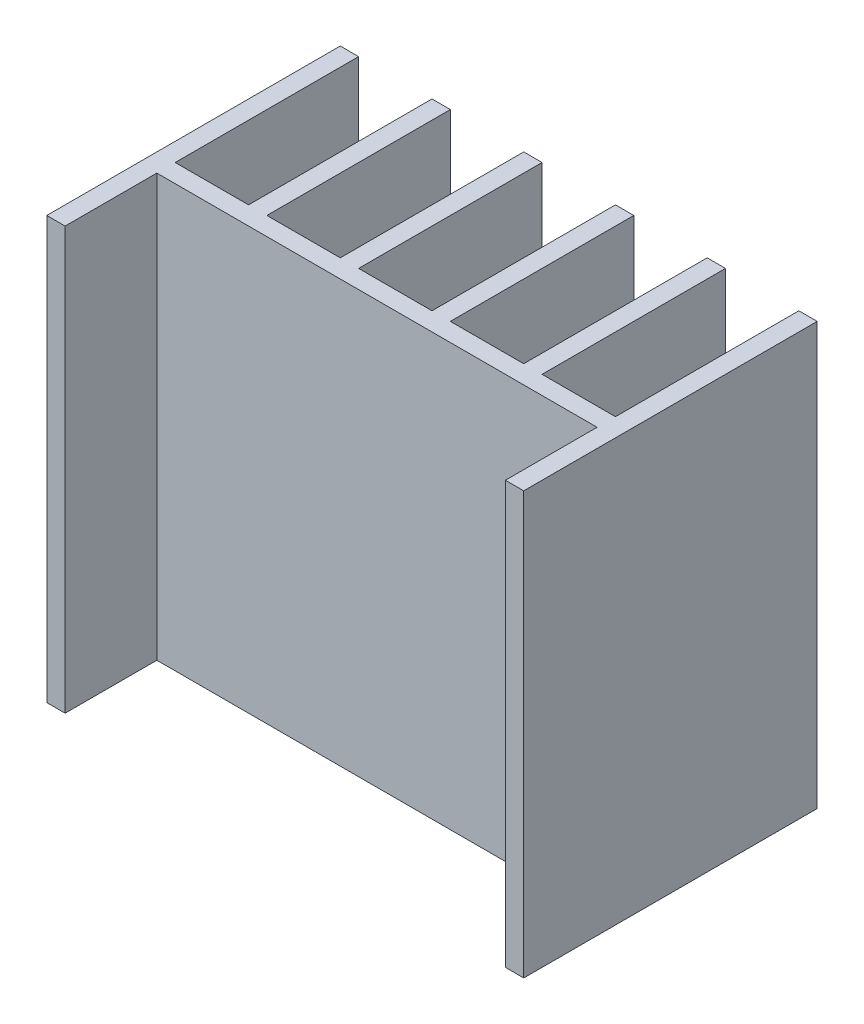
ISO-10303-21;
HEADER;
FILE_DESCRIPTION(('STEP AP214'),'2;1');
FILE_NAME('part.step','',(''),(''),'','','');
FILE_SCHEMA(('AUTOMOTIVE_DESIGN { 1 0 10303 214 1 1 1 1 }'));
ENDSEC;
DATA;
#1=APPLICATION_CONTEXT('core data for automotive mechanical design processes');
#2=APPLICATION_PROTOCOL_DEFINITION('international standard','automotive_design',2000,#1);
#3=PRODUCT_CONTEXT('',#1,'mechanical');
#4=PRODUCT('Part','Part','',(#3));
#5=PRODUCT_RELATED_PRODUCT_CATEGORY('part','',(#4));
#6=PRODUCT_DEFINITION_FORMATION('','',#4);
#7=PRODUCT_DEFINITION_CONTEXT('part definition',#1,'design');
#8=PRODUCT_DEFINITION('design','',#6,#7);
#9=PRODUCT_DEFINITION_SHAPE('','',#8);
#10=(LENGTH_UNIT() NAMED_UNIT(*) SI_UNIT(.MILLI.,.METRE.));
#11=(NAMED_UNIT(*) PLANE_ANGLE_UNIT() SI_UNIT($,.RADIAN.));
#12=(NAMED_UNIT(*) SI_UNIT($,.STERADIAN.) SOLID_ANGLE_UNIT());
#13=UNCERTAINTY_MEASURE_WITH_UNIT(LENGTH_MEASURE(1.E-05),#10,'distance_accuracy_value','');
#14=(GEOMETRIC_REPRESENTATION_CONTEXT(3) GLOBAL_UNCERTAINTY_ASSIGNED_CONTEXT((#13)) GLOBAL_UNIT_ASSIGNED_CONTEXT((#10,
#11,#12)) REPRESENTATION_CONTEXT('',''));
#15=CARTESIAN_POINT('',(0.,0.,0.));
#16=DIRECTION('',(0.,0.,1.));
#17=DIRECTION('',(1.,0.,0.));
#18=AXIS2_PLACEMENT_3D('',#15,#16,#17);
#19=CARTESIAN_POINT('',(12.,23.,-11.));
#20=DIRECTION('',(0.,0.,1.));
#21=DIRECTION('',(1.,0.,0.));
#22=AXIS2_PLACEMENT_3D('',#19,#20,#21);
#23=PLANE('',#22);
#24=DIRECTION('',(-1.,0.,0.));
#25=VECTOR('',#24,1.);
#26=CARTESIAN_POINT('',(12.,0.,-11.));
#27=LINE('',#26,#25);
#28=CARTESIAN_POINT('',(13.,0.,-11.));
#29=VERTEX_POINT('',#28);
#30=CARTESIAN_POINT('',(12.,0.,-11.));
#31=VERTEX_POINT('',#30);
#32=EDGE_CURVE('E251',#29,#31,#27,.T.);
#33=ORIENTED_EDGE('',*,*,#32,.T.);
#34=DIRECTION('',(0.,-1.,0.));
#35=VECTOR('',#34,1.);
#36=CARTESIAN_POINT('',(12.,23.,-11.));
#37=LINE('',#36,#35);
#38=CARTESIAN_POINT('',(12.,23.,-11.));
#39=VERTEX_POINT('',#38);
#40=EDGE_CURVE('E11',#39,#31,#37,.T.);
#41=ORIENTED_EDGE('',*,*,#40,.F.);
#42=DIRECTION('',(-1.,0.,0.));
#43=VECTOR('',#42,1.);
#44=CARTESIAN_POINT('',(12.,23.,-11.));
#45=LINE('',#44,#43);
#46=CARTESIAN_POINT('',(13.,23.,-11.));
#47=VERTEX_POINT('',#46);
#48=EDGE_CURVE('E307',#47,#39,#45,.T.);
#49=ORIENTED_EDGE('',*,*,#48,.F.);
#50=DIRECTION('',(0.,-1.,0.));
#51=VECTOR('',#50,1.);
#52=CARTESIAN_POINT('',(13.,23.,-11.));
#53=LINE('',#52,#51);
#54=EDGE_CURVE('E247',#47,#29,#53,.T.);
#55=ORIENTED_EDGE('',*,*,#54,.T.);
#56=EDGE_LOOP('',(#33,#41,#49,#55));
#57=FACE_BOUND('',#56,.T.);
#58=ADVANCED_FACE('F34',(#57),#23,.F.);
#59=CARTESIAN_POINT('',(12.,23.,-11.));
#60=DIRECTION('',(1.,0.,0.));
#61=DIRECTION('',(0.,0.,-1.));
#62=AXIS2_PLACEMENT_3D('',#59,#60,#61);
#63=PLANE('',#62);
#64=DIRECTION('',(0.,0.,1.));
#65=VECTOR('',#64,1.);
#66=CARTESIAN_POINT('',(12.,0.,-11.));
#67=LINE('',#66,#65);
#68=CARTESIAN_POINT('',(12.,0.,-0.999999999999995));
#69=VERTEX_POINT('',#68);
#70=EDGE_CURVE('E254',#31,#69,#67,.T.);
#71=ORIENTED_EDGE('',*,*,#70,.T.);
#72=DIRECTION('',(0.,-1.,0.));
#73=VECTOR('',#72,1.);
#74=CARTESIAN_POINT('',(12.,23.,-0.999999999999995));
#75=LINE('',#74,#73);
#76=CARTESIAN_POINT('',(12.,23.,-0.999999999999995));
#77=VERTEX_POINT('',#76);
#78=EDGE_CURVE('E42',#77,#69,#75,.T.);
#79=ORIENTED_EDGE('',*,*,#78,.F.);
#80=DIRECTION('',(0.,0.,1.));
#81=VECTOR('',#80,1.);
#82=CARTESIAN_POINT('',(12.,23.,-11.));
#83=LINE('',#82,#81);
#84=EDGE_CURVE('E151',#39,#77,#83,.T.);
#85=ORIENTED_EDGE('',*,*,#84,.F.);
#86=ORIENTED_EDGE('',*,*,#40,.T.);
#87=EDGE_LOOP('',(#71,#79,#85,#86));
#88=FACE_BOUND('',#87,.T.);
#89=ADVANCED_FACE('F455',(#88),#63,.F.);
#90=CARTESIAN_POINT('',(12.,23.,-0.999999999999995));
#91=DIRECTION('',(0.,0.,1.));
#92=DIRECTION('',(1.,0.,0.));
#93=AXIS2_PLACEMENT_3D('',#90,#91,#92);
#94=PLANE('',#93);
#95=DIRECTION('',(-1.,0.,0.));
#96=VECTOR('',#95,1.);
#97=CARTESIAN_POINT('',(12.,0.,-0.999999999999995));
#98=LINE('',#97,#96);
#99=CARTESIAN_POINT('',(8.,0.,-0.999999999999994));
#100=VERTEX_POINT('',#99);
#101=EDGE_CURVE('E256',#69,#100,#98,.T.);
#102=ORIENTED_EDGE('',*,*,#101,.T.);
#103=DIRECTION('',(0.,-1.,0.));
#104=VECTOR('',#103,1.);
#105=CARTESIAN_POINT('',(8.,23.,-0.999999999999994));
#106=LINE('',#105,#104);
#107=CARTESIAN_POINT('',(8.,23.,-0.999999999999994));
#108=VERTEX_POINT('',#107);
#109=EDGE_CURVE('E374',#108,#100,#106,.T.);
#110=ORIENTED_EDGE('',*,*,#109,.F.);
#111=DIRECTION('',(-1.,0.,0.));
#112=VECTOR('',#111,1.);
#113=CARTESIAN_POINT('',(12.,23.,-0.999999999999995));
#114=LINE('',#113,#112);
#115=EDGE_CURVE('E382',#77,#108,#114,.T.);
#116=ORIENTED_EDGE('',*,*,#115,.F.);
#117=ORIENTED_EDGE('',*,*,#78,.T.);
#118=EDGE_LOOP('',(#102,#110,#116,#117));
#119=FACE_BOUND('',#118,.T.);
#120=ADVANCED_FACE('F380',(#119),#94,.F.);
#121=CARTESIAN_POINT('',(8.,23.,-11.));
#122=DIRECTION('',(-1.,0.,0.));
#123=DIRECTION('',(0.,0.,1.));
#124=AXIS2_PLACEMENT_3D('',#121,#122,#123);
#125=PLANE('',#124);
#126=DIRECTION('',(0.,0.,-1.));
#127=VECTOR('',#126,1.);
#128=CARTESIAN_POINT('',(8.,0.,-11.));
#129=LINE('',#128,#127);
#130=CARTESIAN_POINT('',(8.,0.,-11.));
#131=VERTEX_POINT('',#130);
#132=EDGE_CURVE('E258',#100,#131,#129,.T.);
#133=ORIENTED_EDGE('',*,*,#132,.T.);
#134=DIRECTION('',(0.,-1.,0.));
#135=VECTOR('',#134,1.);
#136=CARTESIAN_POINT('',(8.,23.,-11.));
#137=LINE('',#136,#135);
#138=CARTESIAN_POINT('',(8.,23.,-11.));
#139=VERTEX_POINT('',#138);
#140=EDGE_CURVE('E371',#139,#131,#137,.T.);
#141=ORIENTED_EDGE('',*,*,#140,.F.);
#142=DIRECTION('',(0.,0.,-1.));
#143=VECTOR('',#142,1.);
#144=CARTESIAN_POINT('',(8.,23.,-11.));
#145=LINE('',#144,#143);
#146=EDGE_CURVE('E398',#108,#139,#145,.T.);
#147=ORIENTED_EDGE('',*,*,#146,.F.);
#148=ORIENTED_EDGE('',*,*,#109,.T.);
#149=EDGE_LOOP('',(#133,#141,#147,#148));
#150=FACE_BOUND('',#149,.T.);
#151=ADVANCED_FACE('F389',(#150),#125,.F.);
#152=CARTESIAN_POINT('',(7.,23.,-11.));
#153=DIRECTION('',(0.,0.,1.));
#154=DIRECTION('',(1.,0.,0.));
#155=AXIS2_PLACEMENT_3D('',#152,#153,#154);
#156=PLANE('',#155);
#157=DIRECTION('',(-1.,0.,0.));
#158=VECTOR('',#157,1.);
#159=CARTESIAN_POINT('',(7.,0.,-11.));
#160=LINE('',#159,#158);
#161=CARTESIAN_POINT('',(7.,0.,-11.));
#162=VERTEX_POINT('',#161);
#163=EDGE_CURVE('E260',#131,#162,#160,.T.);
#164=ORIENTED_EDGE('',*,*,#163,.T.);
#165=DIRECTION('',(0.,-1.,0.));
#166=VECTOR('',#165,1.);
#167=CARTESIAN_POINT('',(7.,23.,-11.));
#168=LINE('',#167,#166);
#169=CARTESIAN_POINT('',(7.,23.,-11.));
#170=VERTEX_POINT('',#169);
#171=EDGE_CURVE('E368',#170,#162,#168,.T.);
#172=ORIENTED_EDGE('',*,*,#171,.F.);
#173=DIRECTION('',(-1.,0.,0.));
#174=VECTOR('',#173,1.);
#175=CARTESIAN_POINT('',(7.,23.,-11.));
#176=LINE('',#175,#174);
#177=EDGE_CURVE('E395',#139,#170,#176,.T.);
#178=ORIENTED_EDGE('',*,*,#177,.F.);
#179=ORIENTED_EDGE('',*,*,#140,.T.);
#180=EDGE_LOOP('',(#164,#172,#178,#179));
#181=FACE_BOUND('',#180,.T.);
#182=ADVANCED_FACE('F393',(#181),#156,.F.);
#183=CARTESIAN_POINT('',(7.,23.,-11.));
#184=DIRECTION('',(1.,0.,0.));
#185=DIRECTION('',(0.,0.,-1.));
#186=AXIS2_PLACEMENT_3D('',#183,#184,#185);
#187=PLANE('',#186);
#188=DIRECTION('',(0.,0.,1.));
#189=VECTOR('',#188,1.);
#190=CARTESIAN_POINT('',(7.,0.,-11.));
#191=LINE('',#190,#189);
#192=CARTESIAN_POINT('',(7.,0.,-1.));
#193=VERTEX_POINT('',#192);
#194=EDGE_CURVE('E262',#162,#193,#191,.T.);
#195=ORIENTED_EDGE('',*,*,#194,.T.);
#196=DIRECTION('',(0.,-1.,0.));
#197=VECTOR('',#196,1.);
#198=CARTESIAN_POINT('',(7.,23.,-1.));
#199=LINE('',#198,#197);
#200=CARTESIAN_POINT('',(7.,23.,-1.));
#201=VERTEX_POINT('',#200);
#202=EDGE_CURVE('E365',#201,#193,#199,.T.);
#203=ORIENTED_EDGE('',*,*,#202,.F.);
#204=DIRECTION('',(0.,0.,1.));
#205=VECTOR('',#204,1.);
#206=CARTESIAN_POINT('',(7.,23.,-11.));
#207=LINE('',#206,#205);
#208=EDGE_CURVE('E397',#170,#201,#207,.T.);
#209=ORIENTED_EDGE('',*,*,#208,.F.);
#210=ORIENTED_EDGE('',*,*,#171,.T.);
#211=EDGE_LOOP('',(#195,#203,#209,#210));
#212=FACE_BOUND('',#211,.T.);
#213=ADVANCED_FACE('F467',(#212),#187,.F.);
#214=CARTESIAN_POINT('',(7.,23.,-1.));
#215=DIRECTION('',(0.,0.,1.));
#216=DIRECTION('',(1.,0.,0.));
#217=AXIS2_PLACEMENT_3D('',#214,#215,#216);
#218=PLANE('',#217);
#219=DIRECTION('',(-1.,0.,0.));
#220=VECTOR('',#219,1.);
#221=CARTESIAN_POINT('',(7.,0.,-1.));
#222=LINE('',#221,#220);
#223=CARTESIAN_POINT('',(3.,0.,-0.999999999999999));
#224=VERTEX_POINT('',#223);
#225=EDGE_CURVE('E264',#193,#224,#222,.T.);
#226=ORIENTED_EDGE('',*,*,#225,.T.);
#227=DIRECTION('',(0.,-1.,0.));
#228=VECTOR('',#227,1.);
#229=CARTESIAN_POINT('',(3.,23.,-0.999999999999999));
#230=LINE('',#229,#228);
#231=CARTESIAN_POINT('',(3.,23.,-0.999999999999999));
#232=VERTEX_POINT('',#231);
#233=EDGE_CURVE('E362',#232,#224,#230,.T.);
#234=ORIENTED_EDGE('',*,*,#233,.F.);
#235=DIRECTION('',(-1.,0.,0.));
#236=VECTOR('',#235,1.);
#237=CARTESIAN_POINT('',(7.,23.,-1.));
#238=LINE('',#237,#236);
#239=EDGE_CURVE('E400',#201,#232,#238,.T.);
#240=ORIENTED_EDGE('',*,*,#239,.F.);
#241=ORIENTED_EDGE('',*,*,#202,.T.);
#242=EDGE_LOOP('',(#226,#234,#240,#241));
#243=FACE_BOUND('',#242,.T.);
#244=ADVANCED_FACE('F470',(#243),#218,.F.);
#245=CARTESIAN_POINT('',(3.,23.,-11.));
#246=DIRECTION('',(-1.,0.,0.));
#247=DIRECTION('',(0.,0.,1.));
#248=AXIS2_PLACEMENT_3D('',#245,#246,#247);
#249=PLANE('',#248);
#250=DIRECTION('',(0.,0.,-1.));
#251=VECTOR('',#250,1.);
#252=CARTESIAN_POINT('',(3.,0.,-11.));
#253=LINE('',#252,#251);
#254=CARTESIAN_POINT('',(3.,0.,-11.));
#255=VERTEX_POINT('',#254);
#256=EDGE_CURVE('E266',#224,#255,#253,.T.);
#257=ORIENTED_EDGE('',*,*,#256,.T.);
#258=DIRECTION('',(0.,-1.,0.));
#259=VECTOR('',#258,1.);
#260=CARTESIAN_POINT('',(3.,23.,-11.));
#261=LINE('',#260,#259);
#262=CARTESIAN_POINT('',(3.,23.,-11.));
#263=VERTEX_POINT('',#262);
#264=EDGE_CURVE('E359',#263,#255,#261,.T.);
#265=ORIENTED_EDGE('',*,*,#264,.F.);
#266=DIRECTION('',(0.,0.,-1.));
#267=VECTOR('',#266,1.);
#268=CARTESIAN_POINT('',(3.,23.,-11.));
#269=LINE('',#268,#267);
#270=EDGE_CURVE('E406',#232,#263,#269,.T.);
#271=ORIENTED_EDGE('',*,*,#270,.F.);
#272=ORIENTED_EDGE('',*,*,#233,.T.);
#273=EDGE_LOOP('',(#257,#265,#271,#272));
#274=FACE_BOUND('',#273,.T.);
#275=ADVANCED_FACE('F474',(#274),#249,.F.);
#276=CARTESIAN_POINT('',(2.,23.,-11.));
#277=DIRECTION('',(0.,0.,1.));
#278=DIRECTION('',(1.,0.,0.));
#279=AXIS2_PLACEMENT_3D('',#276,#277,#278);
#280=PLANE('',#279);
#281=DIRECTION('',(-1.,0.,0.));
#282=VECTOR('',#281,1.);
#283=CARTESIAN_POINT('',(2.,0.,-11.));
#284=LINE('',#283,#282);
#285=CARTESIAN_POINT('',(2.,0.,-11.));
#286=VERTEX_POINT('',#285);
#287=EDGE_CURVE('E268',#255,#286,#284,.T.);
#288=ORIENTED_EDGE('',*,*,#287,.T.);
#289=DIRECTION('',(0.,-1.,0.));
#290=VECTOR('',#289,1.);
#291=CARTESIAN_POINT('',(2.,23.,-11.));
#292=LINE('',#291,#290);
#293=CARTESIAN_POINT('',(2.,23.,-11.));
#294=VERTEX_POINT('',#293);
#295=EDGE_CURVE('E356',#294,#286,#292,.T.);
#296=ORIENTED_EDGE('',*,*,#295,.F.);
#297=DIRECTION('',(-1.,0.,0.));
#298=VECTOR('',#297,1.);
#299=CARTESIAN_POINT('',(2.,23.,-11.));
#300=LINE('',#299,#298);
#301=EDGE_CURVE('E408',#263,#294,#300,.T.);
#302=ORIENTED_EDGE('',*,*,#301,.F.);
#303=ORIENTED_EDGE('',*,*,#264,.T.);
#304=EDGE_LOOP('',(#288,#296,#302,#303));
#305=FACE_BOUND('',#304,.T.);
#306=ADVANCED_FACE('F478',(#305),#280,.F.);
#307=CARTESIAN_POINT('',(2.,23.,-11.));
#308=DIRECTION('',(1.,0.,0.));
#309=DIRECTION('',(0.,0.,-1.));
#310=AXIS2_PLACEMENT_3D('',#307,#308,#309);
#311=PLANE('',#310);
#312=DIRECTION('',(0.,0.,1.));
#313=VECTOR('',#312,1.);
#314=CARTESIAN_POINT('',(2.,0.,-11.));
#315=LINE('',#314,#313);
#316=CARTESIAN_POINT('',(2.,0.,-0.999999999999999));
#317=VERTEX_POINT('',#316);
#318=EDGE_CURVE('E270',#286,#317,#315,.T.);
#319=ORIENTED_EDGE('',*,*,#318,.T.);
#320=DIRECTION('',(0.,-1.,0.));
#321=VECTOR('',#320,1.);
#322=CARTESIAN_POINT('',(2.,23.,-0.999999999999999));
#323=LINE('',#322,#321);
#324=CARTESIAN_POINT('',(2.,23.,-0.999999999999999));
#325=VERTEX_POINT('',#324);
#326=EDGE_CURVE('E353',#325,#317,#323,.T.);
#327=ORIENTED_EDGE('',*,*,#326,.F.);
#328=DIRECTION('',(0.,0.,1.));
#329=VECTOR('',#328,1.);
#330=CARTESIAN_POINT('',(2.,23.,-11.));
#331=LINE('',#330,#329);
#332=EDGE_CURVE('E410',#294,#325,#331,.T.);
#333=ORIENTED_EDGE('',*,*,#332,.F.);
#334=ORIENTED_EDGE('',*,*,#295,.T.);
#335=EDGE_LOOP('',(#319,#327,#333,#334));
#336=FACE_BOUND('',#335,.T.);
#337=ADVANCED_FACE('F482',(#336),#311,.F.);
#338=CARTESIAN_POINT('',(-2.,23.,-0.999999999999999));
#339=DIRECTION('',(0.,0.,1.));
#340=DIRECTION('',(1.,0.,0.));
#341=AXIS2_PLACEMENT_3D('',#338,#339,#340);
#342=PLANE('',#341);
#343=DIRECTION('',(-1.,0.,0.));
#344=VECTOR('',#343,1.);
#345=CARTESIAN_POINT('',(-2.,0.,-0.999999999999999));
#346=LINE('',#345,#344);
#347=CARTESIAN_POINT('',(-2.,0.,-0.999999999999999));
#348=VERTEX_POINT('',#347);
#349=EDGE_CURVE('E272',#317,#348,#346,.T.);
#350=ORIENTED_EDGE('',*,*,#349,.T.);
#351=DIRECTION('',(0.,-1.,0.));
#352=VECTOR('',#351,1.);
#353=CARTESIAN_POINT('',(-2.,23.,-0.999999999999999));
#354=LINE('',#353,#352);
#355=CARTESIAN_POINT('',(-2.,23.,-0.999999999999999));
#356=VERTEX_POINT('',#355);
#357=EDGE_CURVE('E350',#356,#348,#354,.T.);
#358=ORIENTED_EDGE('',*,*,#357,.F.);
#359=DIRECTION('',(-1.,0.,0.));
#360=VECTOR('',#359,1.);
#361=CARTESIAN_POINT('',(-2.,23.,-0.999999999999999));
#362=LINE('',#361,#360);
#363=EDGE_CURVE('E412',#325,#356,#362,.T.);
#364=ORIENTED_EDGE('',*,*,#363,.F.);
#365=ORIENTED_EDGE('',*,*,#326,.T.);
#366=EDGE_LOOP('',(#350,#358,#364,#365));
#367=FACE_BOUND('',#366,.T.);
#368=ADVANCED_FACE('F486',(#367),#342,.F.);
#369=CARTESIAN_POINT('',(-2.,23.,-11.));
#370=DIRECTION('',(-1.,0.,0.));
#371=DIRECTION('',(0.,0.,1.));
#372=AXIS2_PLACEMENT_3D('',#369,#370,#371);
#373=PLANE('',#372);
#374=DIRECTION('',(0.,0.,-1.));
#375=VECTOR('',#374,1.);
#376=CARTESIAN_POINT('',(-2.,0.,-11.));
#377=LINE('',#376,#375);
#378=CARTESIAN_POINT('',(-2.,0.,-11.));
#379=VERTEX_POINT('',#378);
#380=EDGE_CURVE('E274',#348,#379,#377,.T.);
#381=ORIENTED_EDGE('',*,*,#380,.T.);
#382=DIRECTION('',(0.,-1.,0.));
#383=VECTOR('',#382,1.);
#384=CARTESIAN_POINT('',(-2.,23.,-11.));
#385=LINE('',#384,#383);
#386=CARTESIAN_POINT('',(-2.,23.,-11.));
#387=VERTEX_POINT('',#386);
#388=EDGE_CURVE('E347',#387,#379,#385,.T.);
#389=ORIENTED_EDGE('',*,*,#388,.F.);
#390=DIRECTION('',(0.,0.,-1.));
#391=VECTOR('',#390,1.);
#392=CARTESIAN_POINT('',(-2.,23.,-11.));
#393=LINE('',#392,#391);
#394=EDGE_CURVE('E414',#356,#387,#393,.T.);
#395=ORIENTED_EDGE('',*,*,#394,.F.);
#396=ORIENTED_EDGE('',*,*,#357,.T.);
#397=EDGE_LOOP('',(#381,#389,#395,#396));
#398=FACE_BOUND('',#397,.T.);
#399=ADVANCED_FACE('F490',(#398),#373,.F.);
#400=CARTESIAN_POINT('',(-2.,23.,-11.));
#401=DIRECTION('',(0.,0.,1.));
#402=DIRECTION('',(1.,0.,0.));
#403=AXIS2_PLACEMENT_3D('',#400,#401,#402);
#404=PLANE('',#403);
#405=DIRECTION('',(-1.,0.,0.));
#406=VECTOR('',#405,1.);
#407=CARTESIAN_POINT('',(-2.,0.,-11.));
#408=LINE('',#407,#406);
#409=CARTESIAN_POINT('',(-3.,0.,-11.));
#410=VERTEX_POINT('',#409);
#411=EDGE_CURVE('E276',#379,#410,#408,.T.);
#412=ORIENTED_EDGE('',*,*,#411,.T.);
#413=DIRECTION('',(0.,-1.,0.));
#414=VECTOR('',#413,1.);
#415=CARTESIAN_POINT('',(-3.,23.,-11.));
#416=LINE('',#415,#414);
#417=CARTESIAN_POINT('',(-3.,23.,-11.));
#418=VERTEX_POINT('',#417);
#419=EDGE_CURVE('E344',#418,#410,#416,.T.);
#420=ORIENTED_EDGE('',*,*,#419,.F.);
#421=DIRECTION('',(-1.,0.,0.));
#422=VECTOR('',#421,1.);
#423=CARTESIAN_POINT('',(-2.,23.,-11.));
#424=LINE('',#423,#422);
#425=EDGE_CURVE('E416',#387,#418,#424,.T.);
#426=ORIENTED_EDGE('',*,*,#425,.F.);
#427=ORIENTED_EDGE('',*,*,#388,.T.);
#428=EDGE_LOOP('',(#412,#420,#426,#427));
#429=FACE_BOUND('',#428,.T.);
#430=ADVANCED_FACE('F494',(#429),#404,.F.);
#431=CARTESIAN_POINT('',(-3.,23.,-11.));
#432=DIRECTION('',(1.,0.,0.));
#433=DIRECTION('',(0.,0.,-1.));
#434=AXIS2_PLACEMENT_3D('',#431,#432,#433);
#435=PLANE('',#434);
#436=DIRECTION('',(0.,0.,1.));
#437=VECTOR('',#436,1.);
#438=CARTESIAN_POINT('',(-3.,0.,-11.));
#439=LINE('',#438,#437);
#440=CARTESIAN_POINT('',(-3.,0.,-0.999999999999999));
#441=VERTEX_POINT('',#440);
#442=EDGE_CURVE('E278',#410,#441,#439,.T.);
#443=ORIENTED_EDGE('',*,*,#442,.T.);
#444=DIRECTION('',(0.,-1.,0.));
#445=VECTOR('',#444,1.);
#446=CARTESIAN_POINT('',(-3.,23.,-0.999999999999999));
#447=LINE('',#446,#445);
#448=CARTESIAN_POINT('',(-3.,23.,-0.999999999999999));
#449=VERTEX_POINT('',#448);
#450=EDGE_CURVE('E341',#449,#441,#447,.T.);
#451=ORIENTED_EDGE('',*,*,#450,.F.);
#452=DIRECTION('',(0.,0.,1.));
#453=VECTOR('',#452,1.);
#454=CARTESIAN_POINT('',(-3.,23.,-11.));
#455=LINE('',#454,#453);
#456=EDGE_CURVE('E418',#418,#449,#455,.T.);
#457=ORIENTED_EDGE('',*,*,#456,.F.);
#458=ORIENTED_EDGE('',*,*,#419,.T.);
#459=EDGE_LOOP('',(#443,#451,#457,#458));
#460=FACE_BOUND('',#459,.T.);
#461=ADVANCED_FACE('F498',(#460),#435,.F.);
#462=CARTESIAN_POINT('',(-7.,23.,-1.));
#463=DIRECTION('',(0.,0.,1.));
#464=DIRECTION('',(1.,0.,0.));
#465=AXIS2_PLACEMENT_3D('',#462,#463,#464);
#466=PLANE('',#465);
#467=DIRECTION('',(-1.,0.,0.));
#468=VECTOR('',#467,1.);
#469=CARTESIAN_POINT('',(-7.,0.,-1.));
#470=LINE('',#469,#468);
#471=CARTESIAN_POINT('',(-7.,0.,-1.));
#472=VERTEX_POINT('',#471);
#473=EDGE_CURVE('E280',#441,#472,#470,.T.);
#474=ORIENTED_EDGE('',*,*,#473,.T.);
#475=DIRECTION('',(0.,-1.,0.));
#476=VECTOR('',#475,1.);
#477=CARTESIAN_POINT('',(-7.,23.,-1.));
#478=LINE('',#477,#476);
#479=CARTESIAN_POINT('',(-7.,23.,-1.));
#480=VERTEX_POINT('',#479);
#481=EDGE_CURVE('E338',#480,#472,#478,.T.);
#482=ORIENTED_EDGE('',*,*,#481,.F.);
#483=DIRECTION('',(-1.,0.,0.));
#484=VECTOR('',#483,1.);
#485=CARTESIAN_POINT('',(-7.,23.,-1.));
#486=LINE('',#485,#484);
#487=EDGE_CURVE('E420',#449,#480,#486,.T.);
#488=ORIENTED_EDGE('',*,*,#487,.F.);
#489=ORIENTED_EDGE('',*,*,#450,.T.);
#490=EDGE_LOOP('',(#474,#482,#488,#489));
#491=FACE_BOUND('',#490,.T.);
#492=ADVANCED_FACE('F502',(#491),#466,.F.);
#493=CARTESIAN_POINT('',(-7.,23.,-11.));
#494=DIRECTION('',(-1.,0.,0.));
#495=DIRECTION('',(0.,0.,1.));
#496=AXIS2_PLACEMENT_3D('',#493,#494,#495);
#497=PLANE('',#496);
#498=DIRECTION('',(0.,0.,-1.));
#499=VECTOR('',#498,1.);
#500=CARTESIAN_POINT('',(-7.,0.,-11.));
#501=LINE('',#500,#499);
#502=CARTESIAN_POINT('',(-7.,0.,-11.));
#503=VERTEX_POINT('',#502);
#504=EDGE_CURVE('E282',#472,#503,#501,.T.);
#505=ORIENTED_EDGE('',*,*,#504,.T.);
#506=DIRECTION('',(0.,-1.,0.));
#507=VECTOR('',#506,1.);
#508=CARTESIAN_POINT('',(-7.,23.,-11.));
#509=LINE('',#508,#507);
#510=CARTESIAN_POINT('',(-7.,23.,-11.));
#511=VERTEX_POINT('',#510);
#512=EDGE_CURVE('E335',#511,#503,#509,.T.);
#513=ORIENTED_EDGE('',*,*,#512,.F.);
#514=DIRECTION('',(0.,0.,-1.));
#515=VECTOR('',#514,1.);
#516=CARTESIAN_POINT('',(-7.,23.,-11.));
#517=LINE('',#516,#515);
#518=EDGE_CURVE('E422',#480,#511,#517,.T.);
#519=ORIENTED_EDGE('',*,*,#518,.F.);
#520=ORIENTED_EDGE('',*,*,#481,.T.);
#521=EDGE_LOOP('',(#505,#513,#519,#520));
#522=FACE_BOUND('',#521,.T.);
#523=ADVANCED_FACE('F506',(#522),#497,.F.);
#524=CARTESIAN_POINT('',(-7.,23.,-11.));
#525=DIRECTION('',(0.,0.,1.));
#526=DIRECTION('',(1.,0.,0.));
#527=AXIS2_PLACEMENT_3D('',#524,#525,#526);
#528=PLANE('',#527);
#529=DIRECTION('',(-1.,0.,0.));
#530=VECTOR('',#529,1.);
#531=CARTESIAN_POINT('',(-7.,0.,-11.));
#532=LINE('',#531,#530);
#533=CARTESIAN_POINT('',(-8.,0.,-11.));
#534=VERTEX_POINT('',#533);
#535=EDGE_CURVE('E284',#503,#534,#532,.T.);
#536=ORIENTED_EDGE('',*,*,#535,.T.);
#537=DIRECTION('',(0.,-1.,0.));
#538=VECTOR('',#537,1.);
#539=CARTESIAN_POINT('',(-8.,23.,-11.));
#540=LINE('',#539,#538);
#541=CARTESIAN_POINT('',(-8.,23.,-11.));
#542=VERTEX_POINT('',#541);
#543=EDGE_CURVE('E332',#542,#534,#540,.T.);
#544=ORIENTED_EDGE('',*,*,#543,.F.);
#545=DIRECTION('',(-1.,0.,0.));
#546=VECTOR('',#545,1.);
#547=CARTESIAN_POINT('',(-7.,23.,-11.));
#548=LINE('',#547,#546);
#549=EDGE_CURVE('E424',#511,#542,#548,.T.);
#550=ORIENTED_EDGE('',*,*,#549,.F.);
#551=ORIENTED_EDGE('',*,*,#512,.T.);
#552=EDGE_LOOP('',(#536,#544,#550,#551));
#553=FACE_BOUND('',#552,.T.);
#554=ADVANCED_FACE('F510',(#553),#528,.F.);
#555=CARTESIAN_POINT('',(-8.,23.,-11.));
#556=DIRECTION('',(1.,0.,0.));
#557=DIRECTION('',(0.,0.,-1.));
#558=AXIS2_PLACEMENT_3D('',#555,#556,#557);
#559=PLANE('',#558);
#560=DIRECTION('',(0.,0.,1.));
#561=VECTOR('',#560,1.);
#562=CARTESIAN_POINT('',(-8.,0.,-11.));
#563=LINE('',#562,#561);
#564=CARTESIAN_POINT('',(-8.,0.,-0.999999999999994));
#565=VERTEX_POINT('',#564);
#566=EDGE_CURVE('E286',#534,#565,#563,.T.);
#567=ORIENTED_EDGE('',*,*,#566,.T.);
#568=DIRECTION('',(0.,-1.,0.));
#569=VECTOR('',#568,1.);
#570=CARTESIAN_POINT('',(-8.,23.,-0.999999999999994));
#571=LINE('',#570,#569);
#572=CARTESIAN_POINT('',(-8.,23.,-0.999999999999994));
#573=VERTEX_POINT('',#572);
#574=EDGE_CURVE('E329',#573,#565,#571,.T.);
#575=ORIENTED_EDGE('',*,*,#574,.F.);
#576=DIRECTION('',(0.,0.,1.));
#577=VECTOR('',#576,1.);
#578=CARTESIAN_POINT('',(-8.,23.,-11.));
#579=LINE('',#578,#577);
#580=EDGE_CURVE('E426',#542,#573,#579,.T.);
#581=ORIENTED_EDGE('',*,*,#580,.F.);
#582=ORIENTED_EDGE('',*,*,#543,.T.);
#583=EDGE_LOOP('',(#567,#575,#581,#582));
#584=FACE_BOUND('',#583,.T.);
#585=ADVANCED_FACE('F514',(#584),#559,.F.);
#586=CARTESIAN_POINT('',(-12.,23.,-0.999999999999995));
#587=DIRECTION('',(0.,0.,1.));
#588=DIRECTION('',(1.,0.,0.));
#589=AXIS2_PLACEMENT_3D('',#586,#587,#588);
#590=PLANE('',#589);
#591=DIRECTION('',(-1.,0.,0.));
#592=VECTOR('',#591,1.);
#593=CARTESIAN_POINT('',(-12.,0.,-0.999999999999995));
#594=LINE('',#593,#592);
#595=CARTESIAN_POINT('',(-12.,0.,-0.999999999999995));
#596=VERTEX_POINT('',#595);
#597=EDGE_CURVE('E288',#565,#596,#594,.T.);
#598=ORIENTED_EDGE('',*,*,#597,.T.);
#599=DIRECTION('',(0.,-1.,0.));
#600=VECTOR('',#599,1.);
#601=CARTESIAN_POINT('',(-12.,23.,-0.999999999999995));
#602=LINE('',#601,#600);
#603=CARTESIAN_POINT('',(-12.,23.,-0.999999999999995));
#604=VERTEX_POINT('',#603);
#605=EDGE_CURVE('E326',#604,#596,#602,.T.);
#606=ORIENTED_EDGE('',*,*,#605,.F.);
#607=DIRECTION('',(-1.,0.,0.));
#608=VECTOR('',#607,1.);
#609=CARTESIAN_POINT('',(-12.,23.,-0.999999999999995));
#610=LINE('',#609,#608);
#611=EDGE_CURVE('E428',#573,#604,#610,.T.);
#612=ORIENTED_EDGE('',*,*,#611,.F.);
#613=ORIENTED_EDGE('',*,*,#574,.T.);
#614=EDGE_LOOP('',(#598,#606,#612,#613));
#615=FACE_BOUND('',#614,.T.);
#616=ADVANCED_FACE('F518',(#615),#590,.F.);
#617=CARTESIAN_POINT('',(-12.,23.,-11.));
#618=DIRECTION('',(-1.,0.,0.));
#619=DIRECTION('',(0.,0.,1.));
#620=AXIS2_PLACEMENT_3D('',#617,#618,#619);
#621=PLANE('',#620);
#622=DIRECTION('',(0.,0.,-1.));
#623=VECTOR('',#622,1.);
#624=CARTESIAN_POINT('',(-12.,0.,-11.));
#625=LINE('',#624,#623);
#626=CARTESIAN_POINT('',(-12.,0.,-11.));
#627=VERTEX_POINT('',#626);
#628=EDGE_CURVE('E290',#596,#627,#625,.T.);
#629=ORIENTED_EDGE('',*,*,#628,.T.);
#630=DIRECTION('',(0.,-1.,0.));
#631=VECTOR('',#630,1.);
#632=CARTESIAN_POINT('',(-12.,23.,-11.));
#633=LINE('',#632,#631);
#634=CARTESIAN_POINT('',(-12.,23.,-11.));
#635=VERTEX_POINT('',#634);
#636=EDGE_CURVE('E323',#635,#627,#633,.T.);
#637=ORIENTED_EDGE('',*,*,#636,.F.);
#638=DIRECTION('',(0.,0.,-1.));
#639=VECTOR('',#638,1.);
#640=CARTESIAN_POINT('',(-12.,23.,-11.));
#641=LINE('',#640,#639);
#642=EDGE_CURVE('E430',#604,#635,#641,.T.);
#643=ORIENTED_EDGE('',*,*,#642,.F.);
#644=ORIENTED_EDGE('',*,*,#605,.T.);
#645=EDGE_LOOP('',(#629,#637,#643,#644));
#646=FACE_BOUND('',#645,.T.);
#647=ADVANCED_FACE('F522',(#646),#621,.F.);
#648=CARTESIAN_POINT('',(-12.,23.,-11.));
#649=DIRECTION('',(0.,0.,1.));
#650=DIRECTION('',(1.,0.,0.));
#651=AXIS2_PLACEMENT_3D('',#648,#649,#650);
#652=PLANE('',#651);
#653=DIRECTION('',(-1.,0.,0.));
#654=VECTOR('',#653,1.);
#655=CARTESIAN_POINT('',(-12.,0.,-11.));
#656=LINE('',#655,#654);
#657=CARTESIAN_POINT('',(-13.,0.,-11.));
#658=VERTEX_POINT('',#657);
#659=EDGE_CURVE('E292',#627,#658,#656,.T.);
#660=ORIENTED_EDGE('',*,*,#659,.T.);
#661=DIRECTION('',(0.,-1.,0.));
#662=VECTOR('',#661,1.);
#663=CARTESIAN_POINT('',(-13.,23.,-11.));
#664=LINE('',#663,#662);
#665=CARTESIAN_POINT('',(-13.,23.,-11.));
#666=VERTEX_POINT('',#665);
#667=EDGE_CURVE('E320',#666,#658,#664,.T.);
#668=ORIENTED_EDGE('',*,*,#667,.F.);
#669=DIRECTION('',(-1.,0.,0.));
#670=VECTOR('',#669,1.);
#671=CARTESIAN_POINT('',(-12.,23.,-11.));
#672=LINE('',#671,#670);
#673=EDGE_CURVE('E432',#635,#666,#672,.T.);
#674=ORIENTED_EDGE('',*,*,#673,.F.);
#675=ORIENTED_EDGE('',*,*,#636,.T.);
#676=EDGE_LOOP('',(#660,#668,#674,#675));
#677=FACE_BOUND('',#676,.T.);
#678=ADVANCED_FACE('F526',(#677),#652,.F.);
#679=CARTESIAN_POINT('',(-13.,23.,3.96846339606609));
#680=DIRECTION('',(1.,0.,0.));
#681=DIRECTION('',(0.,0.,-1.));
#682=AXIS2_PLACEMENT_3D('',#679,#680,#681);
#683=PLANE('',#682);
#684=DIRECTION('',(0.,0.,1.));
#685=VECTOR('',#684,1.);
#686=CARTESIAN_POINT('',(-13.,0.,3.96846339606609));
#687=LINE('',#686,#685);
#688=CARTESIAN_POINT('',(-13.,0.,5.));
#689=VERTEX_POINT('',#688);
#690=EDGE_CURVE('E295',#658,#689,#687,.T.);
#691=ORIENTED_EDGE('',*,*,#690,.T.);
#692=DIRECTION('',(0.,-1.,0.));
#693=VECTOR('',#692,1.);
#694=CARTESIAN_POINT('',(-13.,23.,5.));
#695=LINE('',#694,#693);
#696=CARTESIAN_POINT('',(-13.,23.,5.));
#697=VERTEX_POINT('',#696);
#698=EDGE_CURVE('E317',#697,#689,#695,.T.);
#699=ORIENTED_EDGE('',*,*,#698,.F.);
#700=DIRECTION('',(0.,0.,1.));
#701=VECTOR('',#700,1.);
#702=CARTESIAN_POINT('',(-13.,23.,3.96846339606609));
#703=LINE('',#702,#701);
#704=EDGE_CURVE('E434',#666,#697,#703,.T.);
#705=ORIENTED_EDGE('',*,*,#704,.F.);
#706=ORIENTED_EDGE('',*,*,#667,.T.);
#707=EDGE_LOOP('',(#691,#699,#705,#706));
#708=FACE_BOUND('',#707,.T.);
#709=ADVANCED_FACE('F530',(#708),#683,.F.);
#710=CARTESIAN_POINT('',(-13.,23.,5.));
#711=DIRECTION('',(0.,0.,-1.));
#712=DIRECTION('',(-1.,0.,0.));
#713=AXIS2_PLACEMENT_3D('',#710,#711,#712);
#714=PLANE('',#713);
#715=DIRECTION('',(1.,0.,0.));
#716=VECTOR('',#715,1.);
#717=CARTESIAN_POINT('',(-13.,0.,5.));
#718=LINE('',#717,#716);
#719=CARTESIAN_POINT('',(-12.,0.,5.));
#720=VERTEX_POINT('',#719);
#721=EDGE_CURVE('E297',#689,#720,#718,.T.);
#722=ORIENTED_EDGE('',*,*,#721,.T.);
#723=DIRECTION('',(0.,-1.,0.));
#724=VECTOR('',#723,1.);
#725=CARTESIAN_POINT('',(-12.,23.,5.));
#726=LINE('',#725,#724);
#727=CARTESIAN_POINT('',(-12.,23.,5.));
#728=VERTEX_POINT('',#727);
#729=EDGE_CURVE('E314',#728,#720,#726,.T.);
#730=ORIENTED_EDGE('',*,*,#729,.F.);
#731=DIRECTION('',(1.,0.,0.));
#732=VECTOR('',#731,1.);
#733=CARTESIAN_POINT('',(-13.,23.,5.));
#734=LINE('',#733,#732);
#735=EDGE_CURVE('E436',#697,#728,#734,.T.);
#736=ORIENTED_EDGE('',*,*,#735,.F.);
#737=ORIENTED_EDGE('',*,*,#698,.T.);
#738=EDGE_LOOP('',(#722,#730,#736,#737));
#739=FACE_BOUND('',#738,.T.);
#740=ADVANCED_FACE('F534',(#739),#714,.F.);
#741=CARTESIAN_POINT('',(-12.,23.,0.));
#742=DIRECTION('',(-1.,0.,0.));
#743=DIRECTION('',(0.,0.,1.));
#744=AXIS2_PLACEMENT_3D('',#741,#742,#743);
#745=PLANE('',#744);
#746=DIRECTION('',(0.,0.,-1.));
#747=VECTOR('',#746,1.);
#748=CARTESIAN_POINT('',(-12.,0.,0.));
#749=LINE('',#748,#747);
#750=CARTESIAN_POINT('',(-12.,0.,0.));
#751=VERTEX_POINT('',#750);
#752=EDGE_CURVE('E299',#720,#751,#749,.T.);
#753=ORIENTED_EDGE('',*,*,#752,.T.);
#754=DIRECTION('',(0.,-1.,0.));
#755=VECTOR('',#754,1.);
#756=CARTESIAN_POINT('',(-12.,23.,0.));
#757=LINE('',#756,#755);
#758=CARTESIAN_POINT('',(-12.,23.,0.));
#759=VERTEX_POINT('',#758);
#760=EDGE_CURVE('E311',#759,#751,#757,.T.);
#761=ORIENTED_EDGE('',*,*,#760,.F.);
#762=DIRECTION('',(0.,0.,-1.));
#763=VECTOR('',#762,1.);
#764=CARTESIAN_POINT('',(-12.,23.,0.));
#765=LINE('',#764,#763);
#766=EDGE_CURVE('E438',#728,#759,#765,.T.);
#767=ORIENTED_EDGE('',*,*,#766,.F.);
#768=ORIENTED_EDGE('',*,*,#729,.T.);
#769=EDGE_LOOP('',(#753,#761,#767,#768));
#770=FACE_BOUND('',#769,.T.);
#771=ADVANCED_FACE('F444',(#770),#745,.F.);
#772=CARTESIAN_POINT('',(-12.,23.,0.));
#773=DIRECTION('',(0.,0.,-1.));
#774=DIRECTION('',(-1.,0.,0.));
#775=AXIS2_PLACEMENT_3D('',#772,#773,#774);
#776=PLANE('',#775);
#777=DIRECTION('',(1.,0.,0.));
#778=VECTOR('',#777,1.);
#779=CARTESIAN_POINT('',(-12.,0.,0.));
#780=LINE('',#779,#778);
#781=CARTESIAN_POINT('',(12.,0.,0.));
#782=VERTEX_POINT('',#781);
#783=EDGE_CURVE('E301',#751,#782,#780,.T.);
#784=ORIENTED_EDGE('',*,*,#783,.T.);
#785=DIRECTION('',(0.,-1.,0.));
#786=VECTOR('',#785,1.);
#787=CARTESIAN_POINT('',(12.,23.,0.));
#788=LINE('',#787,#786);
#789=CARTESIAN_POINT('',(12.,23.,0.));
#790=VERTEX_POINT('',#789);
#791=EDGE_CURVE('E242',#790,#782,#788,.T.);
#792=ORIENTED_EDGE('',*,*,#791,.F.);
#793=DIRECTION('',(1.,0.,0.));
#794=VECTOR('',#793,1.);
#795=CARTESIAN_POINT('',(-12.,23.,0.));
#796=LINE('',#795,#794);
#797=EDGE_CURVE('E231',#759,#790,#796,.T.);
#798=ORIENTED_EDGE('',*,*,#797,.F.);
#799=ORIENTED_EDGE('',*,*,#760,.T.);
#800=EDGE_LOOP('',(#784,#792,#798,#799));
#801=FACE_BOUND('',#800,.T.);
#802=ADVANCED_FACE('F448',(#801),#776,.F.);
#803=CARTESIAN_POINT('',(12.,23.,0.));
#804=DIRECTION('',(1.,0.,0.));
#805=DIRECTION('',(0.,0.,-1.));
#806=AXIS2_PLACEMENT_3D('',#803,#804,#805);
#807=PLANE('',#806);
#808=DIRECTION('',(0.,0.,1.));
#809=VECTOR('',#808,1.);
#810=CARTESIAN_POINT('',(12.,0.,0.));
#811=LINE('',#810,#809);
#812=CARTESIAN_POINT('',(12.,0.,5.));
#813=VERTEX_POINT('',#812);
#814=EDGE_CURVE('E240',#782,#813,#811,.T.);
#815=ORIENTED_EDGE('',*,*,#814,.T.);
#816=DIRECTION('',(0.,-1.,0.));
#817=VECTOR('',#816,1.);
#818=CARTESIAN_POINT('',(12.,23.,5.));
#819=LINE('',#818,#817);
#820=CARTESIAN_POINT('',(12.,23.,5.));
#821=VERTEX_POINT('',#820);
#822=EDGE_CURVE('E237',#821,#813,#819,.T.);
#823=ORIENTED_EDGE('',*,*,#822,.F.);
#824=DIRECTION('',(0.,0.,1.));
#825=VECTOR('',#824,1.);
#826=CARTESIAN_POINT('',(12.,23.,0.));
#827=LINE('',#826,#825);
#828=EDGE_CURVE('E224',#790,#821,#827,.T.);
#829=ORIENTED_EDGE('',*,*,#828,.F.);
#830=ORIENTED_EDGE('',*,*,#791,.T.);
#831=EDGE_LOOP('',(#815,#823,#829,#830));
#832=FACE_BOUND('',#831,.T.);
#833=ADVANCED_FACE('F238',(#832),#807,.F.);
#834=CARTESIAN_POINT('',(13.,23.,5.));
#835=DIRECTION('',(0.,0.,-1.));
#836=DIRECTION('',(-1.,0.,0.));
#837=AXIS2_PLACEMENT_3D('',#834,#835,#836);
#838=PLANE('',#837);
#839=DIRECTION('',(1.,0.,0.));
#840=VECTOR('',#839,1.);
#841=CARTESIAN_POINT('',(13.,0.,5.));
#842=LINE('',#841,#840);
#843=CARTESIAN_POINT('',(13.,0.,5.));
#844=VERTEX_POINT('',#843);
#845=EDGE_CURVE('E304',#813,#844,#842,.T.);
#846=ORIENTED_EDGE('',*,*,#845,.T.);
#847=DIRECTION('',(0.,-1.,0.));
#848=VECTOR('',#847,1.);
#849=CARTESIAN_POINT('',(13.,23.,5.));
#850=LINE('',#849,#848);
#851=CARTESIAN_POINT('',(13.,23.,5.));
#852=VERTEX_POINT('',#851);
#853=EDGE_CURVE('E243',#852,#844,#850,.T.);
#854=ORIENTED_EDGE('',*,*,#853,.F.);
#855=DIRECTION('',(1.,0.,0.));
#856=VECTOR('',#855,1.);
#857=CARTESIAN_POINT('',(13.,23.,5.));
#858=LINE('',#857,#856);
#859=EDGE_CURVE('E228',#821,#852,#858,.T.);
#860=ORIENTED_EDGE('',*,*,#859,.F.);
#861=ORIENTED_EDGE('',*,*,#822,.T.);
#862=EDGE_LOOP('',(#846,#854,#860,#861));
#863=FACE_BOUND('',#862,.T.);
#864=ADVANCED_FACE('F245',(#863),#838,.F.);
#865=CARTESIAN_POINT('',(13.,23.,3.96846339606609));
#866=DIRECTION('',(-1.,0.,0.));
#867=DIRECTION('',(0.,0.,1.));
#868=AXIS2_PLACEMENT_3D('',#865,#866,#867);
#869=PLANE('',#868);
#870=DIRECTION('',(0.,0.,-1.));
#871=VECTOR('',#870,1.);
#872=CARTESIAN_POINT('',(13.,0.,3.96846339606609));
#873=LINE('',#872,#871);
#874=EDGE_CURVE('E139',#844,#29,#873,.T.);
#875=ORIENTED_EDGE('',*,*,#874,.T.);
#876=ORIENTED_EDGE('',*,*,#54,.F.);
#877=DIRECTION('',(0.,0.,-1.));
#878=VECTOR('',#877,1.);
#879=CARTESIAN_POINT('',(13.,23.,3.96846339606609));
#880=LINE('',#879,#878);
#881=EDGE_CURVE('E50',#852,#47,#880,.T.);
#882=ORIENTED_EDGE('',*,*,#881,.F.);
#883=ORIENTED_EDGE('',*,*,#853,.T.);
#884=EDGE_LOOP('',(#875,#876,#882,#883));
#885=FACE_BOUND('',#884,.T.);
#886=ADVANCED_FACE('F449',(#885),#869,.F.);
#887=CARTESIAN_POINT('',(13.,23.,-11.));
#888=DIRECTION('',(0.,1.,0.));
#889=DIRECTION('',(0.,0.,1.));
#890=AXIS2_PLACEMENT_3D('',#887,#888,#889);
#891=PLANE('',#890);
#892=ORIENTED_EDGE('',*,*,#48,.T.);
#893=ORIENTED_EDGE('',*,*,#84,.T.);
#894=ORIENTED_EDGE('',*,*,#115,.T.);
#895=ORIENTED_EDGE('',*,*,#146,.T.);
#896=ORIENTED_EDGE('',*,*,#177,.T.);
#897=ORIENTED_EDGE('',*,*,#208,.T.);
#898=ORIENTED_EDGE('',*,*,#239,.T.);
#899=ORIENTED_EDGE('',*,*,#270,.T.);
#900=ORIENTED_EDGE('',*,*,#301,.T.);
#901=ORIENTED_EDGE('',*,*,#332,.T.);
#902=ORIENTED_EDGE('',*,*,#363,.T.);
#903=ORIENTED_EDGE('',*,*,#394,.T.);
#904=ORIENTED_EDGE('',*,*,#425,.T.);
#905=ORIENTED_EDGE('',*,*,#456,.T.);
#906=ORIENTED_EDGE('',*,*,#487,.T.);
#907=ORIENTED_EDGE('',*,*,#518,.T.);
#908=ORIENTED_EDGE('',*,*,#549,.T.);
#909=ORIENTED_EDGE('',*,*,#580,.T.);
#910=ORIENTED_EDGE('',*,*,#611,.T.);
#911=ORIENTED_EDGE('',*,*,#642,.T.);
#912=ORIENTED_EDGE('',*,*,#673,.T.);
#913=ORIENTED_EDGE('',*,*,#704,.T.);
#914=ORIENTED_EDGE('',*,*,#735,.T.);
#915=ORIENTED_EDGE('',*,*,#766,.T.);
#916=ORIENTED_EDGE('',*,*,#797,.T.);
#917=ORIENTED_EDGE('',*,*,#828,.T.);
#918=ORIENTED_EDGE('',*,*,#859,.T.);
#919=ORIENTED_EDGE('',*,*,#881,.T.);
#920=EDGE_LOOP('',(#892,#893,#894,#895,#896,#897,#898,#899,#900,#901,#902,#903,#904,#905,#906,
#907,#908,#909,#910,#911,#912,#913,#914,#915,#916,#917,#918,#919));
#921=FACE_BOUND('',#920,.T.);
#922=ADVANCED_FACE('F226',(#921),#891,.T.);
#923=CARTESIAN_POINT('',(13.,0.,-11.));
#924=DIRECTION('',(0.,1.,0.));
#925=DIRECTION('',(0.,0.,1.));
#926=AXIS2_PLACEMENT_3D('',#923,#924,#925);
#927=PLANE('',#926);
#928=ORIENTED_EDGE('',*,*,#32,.F.);
#929=ORIENTED_EDGE('',*,*,#874,.F.);
#930=ORIENTED_EDGE('',*,*,#845,.F.);
#931=ORIENTED_EDGE('',*,*,#814,.F.);
#932=ORIENTED_EDGE('',*,*,#783,.F.);
#933=ORIENTED_EDGE('',*,*,#752,.F.);
#934=ORIENTED_EDGE('',*,*,#721,.F.);
#935=ORIENTED_EDGE('',*,*,#690,.F.);
#936=ORIENTED_EDGE('',*,*,#659,.F.);
#937=ORIENTED_EDGE('',*,*,#628,.F.);
#938=ORIENTED_EDGE('',*,*,#597,.F.);
#939=ORIENTED_EDGE('',*,*,#566,.F.);
#940=ORIENTED_EDGE('',*,*,#535,.F.);
#941=ORIENTED_EDGE('',*,*,#504,.F.);
#942=ORIENTED_EDGE('',*,*,#473,.F.);
#943=ORIENTED_EDGE('',*,*,#442,.F.);
#944=ORIENTED_EDGE('',*,*,#411,.F.);
#945=ORIENTED_EDGE('',*,*,#380,.F.);
#946=ORIENTED_EDGE('',*,*,#349,.F.);
#947=ORIENTED_EDGE('',*,*,#318,.F.);
#948=ORIENTED_EDGE('',*,*,#287,.F.);
#949=ORIENTED_EDGE('',*,*,#256,.F.);
#950=ORIENTED_EDGE('',*,*,#225,.F.);
#951=ORIENTED_EDGE('',*,*,#194,.F.);
#952=ORIENTED_EDGE('',*,*,#163,.F.);
#953=ORIENTED_EDGE('',*,*,#132,.F.);
#954=ORIENTED_EDGE('',*,*,#101,.F.);
#955=ORIENTED_EDGE('',*,*,#70,.F.);
#956=EDGE_LOOP('',(#928,#929,#930,#931,#932,#933,#934,#935,#936,#937,#938,#939,#940,#941,#942,
#943,#944,#945,#946,#947,#948,#949,#950,#951,#952,#953,#954,#955));
#957=FACE_BOUND('',#956,.T.);
#958=ADVANCED_FACE('F384',(#957),#927,.F.);
#959=CLOSED_SHELL('',(#58,#89,#120,#151,#182,#213,#244,#275,#306,#337,#368,#399,#430,#461,#492,
#523,#554,#585,#616,#647,#678,#709,#740,#771,#802,#833,#864,#886,#922,#958));
#960=MANIFOLD_SOLID_BREP('B2',#959);
#961=ADVANCED_BREP_SHAPE_REPRESENTATION('',(#18,#960),#14);
#962=SHAPE_DEFINITION_REPRESENTATION(#9,#961);
ENDSEC;
END-ISO-10303-21;
